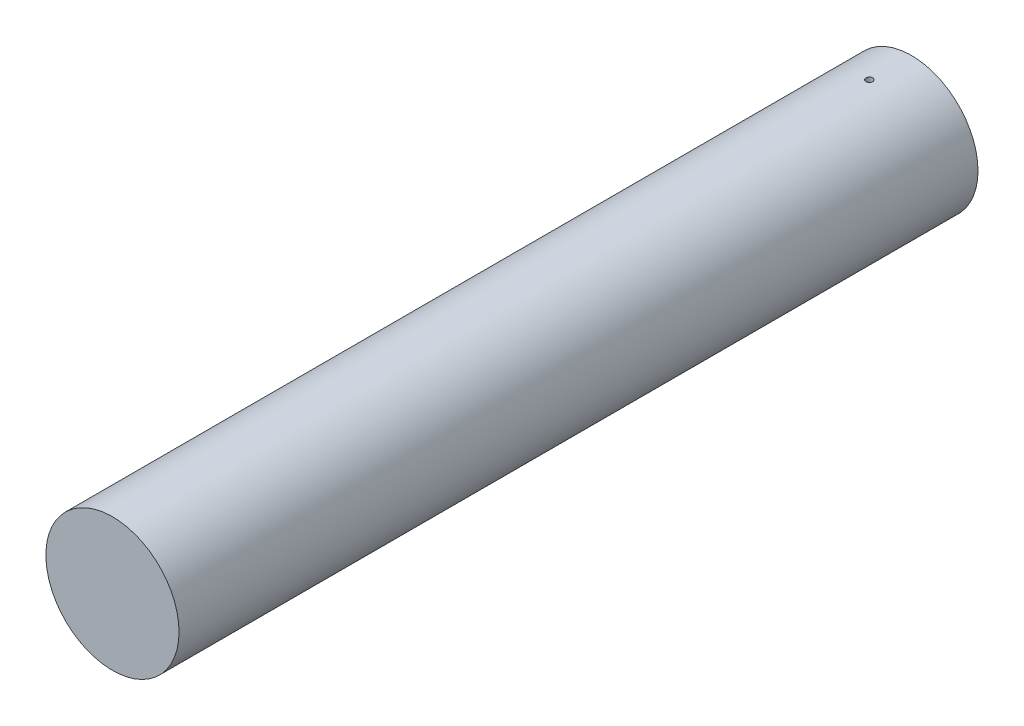
ISO-10303-21;
HEADER;
FILE_DESCRIPTION(('STEP AP214'),'2;1');
FILE_NAME('part.step','',(''),(''),'','','');
FILE_SCHEMA(('AUTOMOTIVE_DESIGN { 1 0 10303 214 1 1 1 1 }'));
ENDSEC;
DATA;
#1=APPLICATION_CONTEXT('core data for automotive mechanical design processes');
#2=APPLICATION_PROTOCOL_DEFINITION('international standard','automotive_design',2000,#1);
#3=PRODUCT_CONTEXT('',#1,'mechanical');
#4=PRODUCT('Part','Part','',(#3));
#5=PRODUCT_RELATED_PRODUCT_CATEGORY('part','',(#4));
#6=PRODUCT_DEFINITION_FORMATION('','',#4);
#7=PRODUCT_DEFINITION_CONTEXT('part definition',#1,'design');
#8=PRODUCT_DEFINITION('design','',#6,#7);
#9=PRODUCT_DEFINITION_SHAPE('','',#8);
#10=(LENGTH_UNIT() NAMED_UNIT(*) SI_UNIT(.MILLI.,.METRE.));
#11=(NAMED_UNIT(*) PLANE_ANGLE_UNIT() SI_UNIT($,.RADIAN.));
#12=(NAMED_UNIT(*) SI_UNIT($,.STERADIAN.) SOLID_ANGLE_UNIT());
#13=UNCERTAINTY_MEASURE_WITH_UNIT(LENGTH_MEASURE(1.E-05),#10,'distance_accuracy_value','');
#14=(GEOMETRIC_REPRESENTATION_CONTEXT(3) GLOBAL_UNCERTAINTY_ASSIGNED_CONTEXT((#13)) GLOBAL_UNIT_ASSIGNED_CONTEXT((#10,
#11,#12)) REPRESENTATION_CONTEXT('',''));
#15=CARTESIAN_POINT('',(0.,0.,0.));
#16=DIRECTION('',(0.,0.,1.));
#17=DIRECTION('',(1.,0.,0.));
#18=AXIS2_PLACEMENT_3D('',#15,#16,#17);
#19=CARTESIAN_POINT('',(0.,0.,1200.));
#20=DIRECTION('',(0.,0.,-1.));
#21=DIRECTION('',(-1.,0.,0.));
#22=AXIS2_PLACEMENT_3D('',#19,#20,#21);
#23=CYLINDRICAL_SURFACE('',#22,100.);
#24=CARTESIAN_POINT('',(0.,-100.,68.2187361680543));
#25=CARTESIAN_POINT('',(0.140382331642108,-100.000000151709,68.2187372645341));
#26=CARTESIAN_POINT('',(0.280747001896507,-99.9997037754659,68.2128216270186));
#27=CARTESIAN_POINT('',(0.560524196558807,-99.9985268736247,68.1892010135076));
#28=CARTESIAN_POINT('',(0.699936466667358,-99.9976461977334,68.1714930042812));
#29=CARTESIAN_POINT('',(0.976889775376588,-99.9953243132263,68.1243896383801));
#30=CARTESIAN_POINT('',(1.11442908371018,-99.9938826184667,68.0949841449047));
#31=CARTESIAN_POINT('',(1.38658724710948,-99.9904790634305,68.0246840844455));
#32=CARTESIAN_POINT('',(1.52120501520938,-99.9885170130257,67.9837853177065));
#33=CARTESIAN_POINT('',(1.78639315934099,-99.9841306024051,67.8908367115256));
#34=CARTESIAN_POINT('',(1.91696698591416,-99.981706649696,67.8387966963325));
#35=CARTESIAN_POINT('',(2.17331240026984,-99.9764630122289,67.7238942423942));
#36=CARTESIAN_POINT('',(2.29908219956735,-99.9736431818819,67.6610278201668));
#37=CARTESIAN_POINT('',(2.54480238231387,-99.9676901690869,67.5249748019133));
#38=CARTESIAN_POINT('',(2.66475624707842,-99.964557177618,67.451794484718));
#39=CARTESIAN_POINT('',(2.8981207370113,-99.9580638527808,67.2955755440559));
#40=CARTESIAN_POINT('',(3.01152892859555,-99.9547034358551,67.2125332887055));
#41=CARTESIAN_POINT('',(3.23100816315515,-99.9478496510534,67.0371558047236));
#42=CARTESIAN_POINT('',(3.3370753956072,-99.9443562155676,66.9448158099962));
#43=CARTESIAN_POINT('',(3.54109502521835,-99.9373357216052,66.7514974573342));
#44=CARTESIAN_POINT('',(3.63904441068014,-99.9338086511865,66.6505159214033));
#45=CARTESIAN_POINT('',(3.82605934353567,-99.9268233553023,66.4406941568297));
#46=CARTESIAN_POINT('',(3.91512779404841,-99.9233651076368,66.3318565164848));
#47=CARTESIAN_POINT('',(4.08381675400835,-99.9166130902244,66.1070228313191));
#48=CARTESIAN_POINT('',(4.16343376352364,-99.9133193816671,65.9910241587401));
#49=CARTESIAN_POINT('',(4.31262612511524,-99.9069909192761,65.7527094566765));
#50=CARTESIAN_POINT('',(4.38220006964921,-99.9039562017646,65.630392544942));
#51=CARTESIAN_POINT('',(4.51082108672322,-99.8982314106714,65.3802815927036));
#52=CARTESIAN_POINT('',(4.56986426013316,-99.8955414648486,65.252485545125));
#53=CARTESIAN_POINT('',(4.67695059650787,-99.8905852183931,64.992402583605));
#54=CARTESIAN_POINT('',(4.72499788182476,-99.8883187590543,64.8601173740756));
#55=CARTESIAN_POINT('',(4.80979140715572,-99.8842714358876,64.5919516581793));
#56=CARTESIAN_POINT('',(4.84653347264903,-99.8824907514625,64.4560698438101));
#57=CARTESIAN_POINT('',(4.93926590709582,-99.8779640739555,64.0448015426298));
#58=CARTESIAN_POINT('',(4.97797010270561,-99.8760235204944,63.7652866555873));
#59=CARTESIAN_POINT('',(5.00788534193595,-99.87452764563,63.2038726531668));
#60=CARTESIAN_POINT('',(4.99909676034997,-99.8749723054035,62.9219735566214));
#61=CARTESIAN_POINT('',(4.93436994296618,-99.8781909718618,62.3638740982336));
#62=CARTESIAN_POINT('',(4.87847401910178,-99.8809628881905,62.087668850165));
#63=CARTESIAN_POINT('',(4.7211683336521,-99.8885214351435,61.5485775580015));
#64=CARTESIAN_POINT('',(4.61975837974242,-99.8933080742813,61.2856915701939));
#65=CARTESIAN_POINT('',(4.3742593576816,-99.9043586910608,60.7805515394792));
#66=CARTESIAN_POINT('',(4.2301509943017,-99.9106233363459,60.5383068881649));
#67=CARTESIAN_POINT('',(3.90335874171009,-99.9239232752185,60.0814322661756));
#68=CARTESIAN_POINT('',(3.7206745802611,-99.9309585742444,59.8668024904015));
#69=CARTESIAN_POINT('',(3.32167794035939,-99.9450161471153,59.4710028769493));
#70=CARTESIAN_POINT('',(3.10532881072658,-99.9520383982217,59.2898699834637));
#71=CARTESIAN_POINT('',(2.64527231828994,-99.9652709741623,58.9664907744451));
#72=CARTESIAN_POINT('',(2.40156494875667,-99.9714812987967,58.8242444684771));
#73=CARTESIAN_POINT('',(1.89368834948846,-99.9823903793968,58.5826797611245));
#74=CARTESIAN_POINT('',(1.62951850556093,-99.9870890899686,58.4833626488728));
#75=CARTESIAN_POINT('',(1.08822535462864,-99.9944447283325,58.3304997455132));
#76=CARTESIAN_POINT('',(0.811102144612571,-99.9971016714097,58.2769536117516));
#77=CARTESIAN_POINT('',(0.252089503471185,-100.000072367754,58.2171981717969));
#78=CARTESIAN_POINT('',(-0.0297944524263533,-100.000388650516,58.2109377649211));
#79=CARTESIAN_POINT('',(-0.590608868682878,-99.9986490964682,58.2457981394827));
#80=CARTESIAN_POINT('',(-0.869539338806887,-99.9965932675041,58.2869187642163));
#81=CARTESIAN_POINT('',(-1.41638577654089,-99.9903426716758,58.415331623414));
#82=CARTESIAN_POINT('',(-1.68430723657538,-99.9861489857459,58.502600525411));
#83=CARTESIAN_POINT('',(-2.20169952573277,-99.9760948290851,58.7208091104926));
#84=CARTESIAN_POINT('',(-2.4511702486381,-99.9702343487596,58.8517490449595));
#85=CARTESIAN_POINT('',(-2.92481416604305,-99.9574995746791,59.1537133509289));
#86=CARTESIAN_POINT('',(-3.14896549854525,-99.9506244164372,59.3247719767536));
#87=CARTESIAN_POINT('',(-3.56538787634977,-99.9366374558743,59.7020688911855));
#88=CARTESIAN_POINT('',(-3.75765871710981,-99.9295256520354,59.9083074054863));
#89=CARTESIAN_POINT('',(-4.1050346820204,-99.9158597154952,60.3503258339873));
#90=CARTESIAN_POINT('',(-4.26010674378105,-99.9093060822093,60.5861317464616));
#91=CARTESIAN_POINT('',(-4.5284557546084,-99.8975035347386,61.0804738746706));
#92=CARTESIAN_POINT('',(-4.64173288557038,-99.8922546148757,61.3390099914753));
#93=CARTESIAN_POINT('',(-4.82322443895271,-99.8836563023528,61.8712990677888));
#94=CARTESIAN_POINT('',(-4.89145993688818,-99.8803060214012,62.1450448454146));
#95=CARTESIAN_POINT('',(-4.98097942137543,-99.8758827218868,62.7002776488897));
#96=CARTESIAN_POINT('',(-5.00226367448989,-99.8748096903952,62.9817646307795));
#97=CARTESIAN_POINT('',(-4.99857754835033,-99.8749923692367,63.4032456376788));
#98=CARTESIAN_POINT('',(-4.99141367944853,-99.8753519535838,63.5436129522638));
#99=CARTESIAN_POINT('',(-4.96530608065759,-99.8766536223232,63.8232310234253));
#100=CARTESIAN_POINT('',(-4.94636670495808,-99.8775954914052,63.962482173453));
#101=CARTESIAN_POINT('',(-4.89682917982177,-99.8800363900157,64.2389331278707));
#102=CARTESIAN_POINT('',(-4.8662267174971,-99.8815356256475,64.3761321538783));
#103=CARTESIAN_POINT('',(-4.79359839136104,-99.8850476130617,64.6474142089162));
#104=CARTESIAN_POINT('',(-4.75157673655706,-99.8870601756199,64.7814983663303));
#105=CARTESIAN_POINT('',(-4.6563864767371,-99.8915428532724,65.0456978790198));
#106=CARTESIAN_POINT('',(-4.60321370373139,-99.8940131394113,65.1758117294113));
#107=CARTESIAN_POINT('',(-4.48613154961846,-99.8993396100469,65.4310493950305));
#108=CARTESIAN_POINT('',(-4.42222612645512,-99.9021956522102,65.5561750288213));
#109=CARTESIAN_POINT('',(-4.28409600695338,-99.9082143744938,65.8006422750243));
#110=CARTESIAN_POINT('',(-4.20986784908656,-99.9113771573656,65.9199819290413));
#111=CARTESIAN_POINT('',(-4.05166478680281,-99.9179176882867,66.1519449954693));
#112=CARTESIAN_POINT('',(-3.96769347409327,-99.9212953569146,66.2645708598144));
#113=CARTESIAN_POINT('',(-3.79045674161889,-99.9281757588154,66.4825056846767));
#114=CARTESIAN_POINT('',(-3.69717888266711,-99.9316786553476,66.5878045241353));
#115=CARTESIAN_POINT('',(-3.50212194671802,-99.9387045122761,66.7901337596339));
#116=CARTESIAN_POINT('',(-3.40034601038945,-99.9422274648157,66.8871671838078));
#117=CARTESIAN_POINT('',(-3.1889189042621,-99.9491970333131,67.0723785294958));
#118=CARTESIAN_POINT('',(-3.07926292714261,-99.952643600965,67.1605509652265));
#119=CARTESIAN_POINT('',(-2.85295061471676,-99.9593591464897,67.3273153051178));
#120=CARTESIAN_POINT('',(-2.73629687589383,-99.9626281893849,67.4059107303663));
#121=CARTESIAN_POINT('',(-2.49661953469714,-99.9689015548178,67.5530981968624));
#122=CARTESIAN_POINT('',(-2.3735876749519,-99.9719055198649,67.6216768083982));
#123=CARTESIAN_POINT('',(-2.12221863794283,-99.9775574091476,67.7481930557582));
#124=CARTESIAN_POINT('',(-1.99388341895568,-99.9802054632949,67.8061345770903));
#125=CARTESIAN_POINT('',(-1.73288930064207,-99.9850694351866,67.9109479402222));
#126=CARTESIAN_POINT('',(-1.60023427857055,-99.9872857286261,67.9578294134481));
#127=CARTESIAN_POINT('',(-1.33148381690986,-99.9912256894904,68.0402406554004));
#128=CARTESIAN_POINT('',(-1.19538927648153,-99.9929494842439,68.0757733584718));
#129=CARTESIAN_POINT('',(-0.884387493405927,-99.9962397938324,68.1431047786217));
#130=CARTESIAN_POINT('',(-0.708718247555083,-99.9976446676185,68.1714417092026));
#131=CARTESIAN_POINT('',(-0.355356570711758,-99.9995246743061,68.2092567020352));
#132=CARTESIAN_POINT('',(-0.177664141445725,-99.999999808001,68.2187347803786));
#133=CARTESIAN_POINT('',(0.,-100.,68.2187361680543));
#134=B_SPLINE_CURVE_WITH_KNOTS('',3,(#24,#25,#26,#27,#28,#29,#30,#31,#32,#33,#34,#35,#36,#37,
#38,#39,#40,#41,#42,#43,#44,#45,#46,#47,#48,#49,#50,#51,#52,#53,#54,#55,#56,#57,#58,#59,#60,#61,
#62,#63,#64,#65,#66,#67,#68,#69,#70,#71,#72,#73,#74,#75,#76,#77,#78,#79,#80,#81,#82,#83,#84,#85,
#86,#87,#88,#89,#90,#91,#92,#93,#94,#95,#96,#97,#98,#99,#100,#101,#102,#103,#104,#105,#106,#107,
#108,#109,#110,#111,#112,#113,#114,#115,#116,#117,#118,#119,#120,#121,#122,#123,#124,#125,#126,
#127,#128,#129,#130,#131,#132,#133),.UNSPECIFIED.,.T.,.F.,(4,2,2,2,2,2,2,2,2,2,2,2,2,2,2,2,2,2,
2,2,2,2,2,2,2,2,2,2,2,2,2,2,2,2,2,2,2,2,2,2,2,2,2,2,2,2,2,2,2,2,2,2,2,2,4),(0.,
0.420991766300549,0.842091861845549,1.2635576718506,1.68517769031119,2.10642744830025,
2.52783253392271,2.94898217840585,3.37028740464198,3.79180970554695,4.21348769639668,
4.6350273884405,5.05672269571444,5.47847704660818,5.90038723381811,6.3221389870788,
6.74404628834471,7.58624182332896,8.42843071206195,9.26986394983489,10.1113007432074,
10.9531183597123,11.7949419172948,12.6376884678758,13.4804352257519,14.3232072889514,
15.1659730428822,16.0078279072425,16.8496799873329,17.6911068352556,18.5325385267443,
19.3746912856819,20.2168494475845,21.0597533716675,21.9026536273136,22.7451591998129,
23.5876599890285,24.0089016973097,24.4299877370165,24.8512296412756,25.2723164898215,
25.6935610107844,26.1146505266156,26.5358815886492,26.9569578588808,27.3786046802741,
27.8000963558864,28.2218473873641,28.6434428867912,29.0655985378535,29.4875996760662,
29.909231955023,30.3307551280559,30.8635515537955,31.3963475249166),.UNSPECIFIED.);
#135=CARTESIAN_POINT('',(0.,-100.,68.2187361680543));
#136=VERTEX_POINT('',#135);
#137=EDGE_CURVE('E10',#136,#136,#134,.T.);
#138=ORIENTED_EDGE('',*,*,#137,.T.);
#139=EDGE_LOOP('',(#138));
#140=FACE_BOUND('',#139,.T.);
#141=CARTESIAN_POINT('',(0.,100.,68.2187361680543));
#142=CARTESIAN_POINT('',(-0.140382331642108,100.000000151709,68.2187372645341));
#143=CARTESIAN_POINT('',(-0.280747001896507,99.9997037754659,68.2128216270186));
#144=CARTESIAN_POINT('',(-0.560524196558807,99.9985268736247,68.1892010135076));
#145=CARTESIAN_POINT('',(-0.699936466667358,99.9976461977334,68.1714930042812));
#146=CARTESIAN_POINT('',(-0.976889775376588,99.9953243132263,68.1243896383801));
#147=CARTESIAN_POINT('',(-1.11442908371018,99.9938826184667,68.0949841449047));
#148=CARTESIAN_POINT('',(-1.38658724710948,99.9904790634305,68.0246840844455));
#149=CARTESIAN_POINT('',(-1.52120501520938,99.9885170130257,67.9837853177065));
#150=CARTESIAN_POINT('',(-1.78639315934099,99.9841306024051,67.8908367115256));
#151=CARTESIAN_POINT('',(-1.91696698591416,99.981706649696,67.8387966963325));
#152=CARTESIAN_POINT('',(-2.17331240026984,99.9764630122289,67.7238942423942));
#153=CARTESIAN_POINT('',(-2.29908219956735,99.9736431818819,67.6610278201668));
#154=CARTESIAN_POINT('',(-2.54480238231387,99.9676901690869,67.5249748019133));
#155=CARTESIAN_POINT('',(-2.66475624707842,99.964557177618,67.451794484718));
#156=CARTESIAN_POINT('',(-2.8981207370113,99.9580638527808,67.2955755440559));
#157=CARTESIAN_POINT('',(-3.01152892859555,99.9547034358551,67.2125332887055));
#158=CARTESIAN_POINT('',(-3.23100816315515,99.9478496510534,67.0371558047236));
#159=CARTESIAN_POINT('',(-3.3370753956072,99.9443562155676,66.9448158099962));
#160=CARTESIAN_POINT('',(-3.54109502521835,99.9373357216052,66.7514974573342));
#161=CARTESIAN_POINT('',(-3.63904441068014,99.9338086511865,66.6505159214033));
#162=CARTESIAN_POINT('',(-3.82605934353567,99.9268233553023,66.4406941568297));
#163=CARTESIAN_POINT('',(-3.91512779404841,99.9233651076368,66.3318565164848));
#164=CARTESIAN_POINT('',(-4.08381675400835,99.9166130902244,66.1070228313191));
#165=CARTESIAN_POINT('',(-4.16343376352364,99.9133193816671,65.9910241587401));
#166=CARTESIAN_POINT('',(-4.31262612511524,99.9069909192761,65.7527094566765));
#167=CARTESIAN_POINT('',(-4.38220006964921,99.9039562017646,65.630392544942));
#168=CARTESIAN_POINT('',(-4.51082108672322,99.8982314106714,65.3802815927036));
#169=CARTESIAN_POINT('',(-4.56986426013316,99.8955414648486,65.252485545125));
#170=CARTESIAN_POINT('',(-4.67695059650787,99.8905852183931,64.992402583605));
#171=CARTESIAN_POINT('',(-4.72499788182476,99.8883187590543,64.8601173740756));
#172=CARTESIAN_POINT('',(-4.80979140715572,99.8842714358876,64.5919516581793));
#173=CARTESIAN_POINT('',(-4.84653347264903,99.8824907514625,64.4560698438101));
#174=CARTESIAN_POINT('',(-4.93926590709582,99.8779640739555,64.0448015426298));
#175=CARTESIAN_POINT('',(-4.97797010270561,99.8760235204944,63.7652866555873));
#176=CARTESIAN_POINT('',(-5.00788534193595,99.87452764563,63.2038726531668));
#177=CARTESIAN_POINT('',(-4.99909676034997,99.8749723054035,62.9219735566214));
#178=CARTESIAN_POINT('',(-4.93436994296618,99.8781909718618,62.3638740982336));
#179=CARTESIAN_POINT('',(-4.87847401910178,99.8809628881905,62.087668850165));
#180=CARTESIAN_POINT('',(-4.7211683336521,99.8885214351435,61.5485775580015));
#181=CARTESIAN_POINT('',(-4.61975837974242,99.8933080742813,61.2856915701939));
#182=CARTESIAN_POINT('',(-4.3742593576816,99.9043586910608,60.7805515394792));
#183=CARTESIAN_POINT('',(-4.2301509943017,99.9106233363459,60.5383068881649));
#184=CARTESIAN_POINT('',(-3.90335874171009,99.9239232752185,60.0814322661756));
#185=CARTESIAN_POINT('',(-3.7206745802611,99.9309585742444,59.8668024904015));
#186=CARTESIAN_POINT('',(-3.32167794035939,99.9450161471153,59.4710028769493));
#187=CARTESIAN_POINT('',(-3.10532881072658,99.9520383982217,59.2898699834637));
#188=CARTESIAN_POINT('',(-2.64527231828994,99.9652709741623,58.9664907744451));
#189=CARTESIAN_POINT('',(-2.40156494875667,99.9714812987967,58.8242444684771));
#190=CARTESIAN_POINT('',(-1.89368834948846,99.9823903793968,58.5826797611245));
#191=CARTESIAN_POINT('',(-1.62951850556093,99.9870890899686,58.4833626488728));
#192=CARTESIAN_POINT('',(-1.08822535462864,99.9944447283325,58.3304997455132));
#193=CARTESIAN_POINT('',(-0.811102144612571,99.9971016714097,58.2769536117516));
#194=CARTESIAN_POINT('',(-0.252089503471185,100.000072367754,58.2171981717969));
#195=CARTESIAN_POINT('',(0.0297944524263533,100.000388650516,58.2109377649211));
#196=CARTESIAN_POINT('',(0.590608868682878,99.9986490964682,58.2457981394827));
#197=CARTESIAN_POINT('',(0.869539338806887,99.9965932675041,58.2869187642163));
#198=CARTESIAN_POINT('',(1.41638577654089,99.9903426716758,58.415331623414));
#199=CARTESIAN_POINT('',(1.68430723657538,99.9861489857459,58.502600525411));
#200=CARTESIAN_POINT('',(2.20169952573277,99.9760948290851,58.7208091104926));
#201=CARTESIAN_POINT('',(2.4511702486381,99.9702343487596,58.8517490449595));
#202=CARTESIAN_POINT('',(2.92481416604305,99.9574995746791,59.1537133509289));
#203=CARTESIAN_POINT('',(3.14896549854525,99.9506244164372,59.3247719767536));
#204=CARTESIAN_POINT('',(3.56538787634977,99.9366374558743,59.7020688911855));
#205=CARTESIAN_POINT('',(3.75765871710981,99.9295256520354,59.9083074054863));
#206=CARTESIAN_POINT('',(4.1050346820204,99.9158597154952,60.3503258339873));
#207=CARTESIAN_POINT('',(4.26010674378105,99.9093060822093,60.5861317464616));
#208=CARTESIAN_POINT('',(4.5284557546084,99.8975035347386,61.0804738746706));
#209=CARTESIAN_POINT('',(4.64173288557038,99.8922546148757,61.3390099914753));
#210=CARTESIAN_POINT('',(4.82322443895271,99.8836563023528,61.8712990677888));
#211=CARTESIAN_POINT('',(4.89145993688818,99.8803060214012,62.1450448454146));
#212=CARTESIAN_POINT('',(4.98097942137543,99.8758827218868,62.7002776488897));
#213=CARTESIAN_POINT('',(5.00226367448989,99.8748096903952,62.9817646307795));
#214=CARTESIAN_POINT('',(4.99857754835033,99.8749923692367,63.4032456376788));
#215=CARTESIAN_POINT('',(4.99141367944853,99.8753519535838,63.5436129522638));
#216=CARTESIAN_POINT('',(4.96530608065759,99.8766536223232,63.8232310234253));
#217=CARTESIAN_POINT('',(4.94636670495808,99.8775954914052,63.962482173453));
#218=CARTESIAN_POINT('',(4.89682917982177,99.8800363900157,64.2389331278707));
#219=CARTESIAN_POINT('',(4.8662267174971,99.8815356256475,64.3761321538783));
#220=CARTESIAN_POINT('',(4.79359839136104,99.8850476130617,64.6474142089162));
#221=CARTESIAN_POINT('',(4.75157673655706,99.8870601756199,64.7814983663303));
#222=CARTESIAN_POINT('',(4.6563864767371,99.8915428532724,65.0456978790198));
#223=CARTESIAN_POINT('',(4.60321370373139,99.8940131394113,65.1758117294113));
#224=CARTESIAN_POINT('',(4.48613154961846,99.8993396100469,65.4310493950305));
#225=CARTESIAN_POINT('',(4.42222612645512,99.9021956522102,65.5561750288213));
#226=CARTESIAN_POINT('',(4.28409600695338,99.9082143744938,65.8006422750243));
#227=CARTESIAN_POINT('',(4.20986784908656,99.9113771573656,65.9199819290413));
#228=CARTESIAN_POINT('',(4.05166478680281,99.9179176882867,66.1519449954693));
#229=CARTESIAN_POINT('',(3.96769347409327,99.9212953569146,66.2645708598144));
#230=CARTESIAN_POINT('',(3.79045674161889,99.9281757588154,66.4825056846767));
#231=CARTESIAN_POINT('',(3.69717888266711,99.9316786553476,66.5878045241353));
#232=CARTESIAN_POINT('',(3.50212194671802,99.9387045122761,66.7901337596339));
#233=CARTESIAN_POINT('',(3.40034601038945,99.9422274648157,66.8871671838078));
#234=CARTESIAN_POINT('',(3.1889189042621,99.9491970333131,67.0723785294958));
#235=CARTESIAN_POINT('',(3.07926292714261,99.952643600965,67.1605509652265));
#236=CARTESIAN_POINT('',(2.85295061471676,99.9593591464897,67.3273153051178));
#237=CARTESIAN_POINT('',(2.73629687589383,99.9626281893849,67.4059107303663));
#238=CARTESIAN_POINT('',(2.49661953469714,99.9689015548178,67.5530981968624));
#239=CARTESIAN_POINT('',(2.3735876749519,99.9719055198649,67.6216768083982));
#240=CARTESIAN_POINT('',(2.12221863794283,99.9775574091476,67.7481930557582));
#241=CARTESIAN_POINT('',(1.99388341895568,99.9802054632949,67.8061345770903));
#242=CARTESIAN_POINT('',(1.73288930064207,99.9850694351866,67.9109479402222));
#243=CARTESIAN_POINT('',(1.60023427857055,99.9872857286261,67.9578294134481));
#244=CARTESIAN_POINT('',(1.33148381690986,99.9912256894904,68.0402406554004));
#245=CARTESIAN_POINT('',(1.19538927648153,99.9929494842439,68.0757733584718));
#246=CARTESIAN_POINT('',(0.884387493405927,99.9962397938324,68.1431047786217));
#247=CARTESIAN_POINT('',(0.708718247555083,99.9976446676185,68.1714417092026));
#248=CARTESIAN_POINT('',(0.355356570711758,99.9995246743061,68.2092567020352));
#249=CARTESIAN_POINT('',(0.177664141445725,99.999999808001,68.2187347803786));
#250=CARTESIAN_POINT('',(0.,100.,68.2187361680543));
#251=B_SPLINE_CURVE_WITH_KNOTS('',3,(#141,#142,#143,#144,#145,#146,#147,#148,#149,#150,#151,
#152,#153,#154,#155,#156,#157,#158,#159,#160,#161,#162,#163,#164,#165,#166,#167,#168,#169,#170,
#171,#172,#173,#174,#175,#176,#177,#178,#179,#180,#181,#182,#183,#184,#185,#186,#187,#188,#189,
#190,#191,#192,#193,#194,#195,#196,#197,#198,#199,#200,#201,#202,#203,#204,#205,#206,#207,#208,
#209,#210,#211,#212,#213,#214,#215,#216,#217,#218,#219,#220,#221,#222,#223,#224,#225,#226,#227,
#228,#229,#230,#231,#232,#233,#234,#235,#236,#237,#238,#239,#240,#241,#242,#243,#244,#245,#246,
#247,#248,#249,#250),.UNSPECIFIED.,.T.,.F.,(4,2,2,2,2,2,2,2,2,2,2,2,2,2,2,2,2,2,2,2,2,2,2,2,2,2,
2,2,2,2,2,2,2,2,2,2,2,2,2,2,2,2,2,2,2,2,2,2,2,2,2,2,2,2,4),(0.,0.420991766300549,
0.842091861845549,1.2635576718506,1.68517769031119,2.10642744830025,2.52783253392271,
2.94898217840585,3.37028740464198,3.79180970554695,4.21348769639668,4.6350273884405,
5.05672269571444,5.47847704660818,5.90038723381811,6.3221389870788,6.74404628834471,
7.58624182332896,8.42843071206195,9.26986394983489,10.1113007432074,10.9531183597123,
11.7949419172948,12.6376884678758,13.4804352257519,14.3232072889514,15.1659730428822,
16.0078279072425,16.8496799873329,17.6911068352556,18.5325385267443,19.3746912856819,
20.2168494475845,21.0597533716675,21.9026536273136,22.7451591998129,23.5876599890285,
24.0089016973097,24.4299877370165,24.8512296412756,25.2723164898215,25.6935610107844,
26.1146505266156,26.5358815886492,26.9569578588808,27.3786046802741,27.8000963558864,
28.2218473873641,28.6434428867912,29.0655985378535,29.4875996760662,29.909231955023,
30.3307551280559,30.8635515537955,31.3963475249166),.UNSPECIFIED.);
#252=CARTESIAN_POINT('',(0.,100.,68.2187361680543));
#253=VERTEX_POINT('',#252);
#254=EDGE_CURVE('E48',#253,#253,#251,.T.);
#255=ORIENTED_EDGE('',*,*,#254,.T.);
#256=EDGE_LOOP('',(#255));
#257=FACE_BOUND('',#256,.T.);
#258=CARTESIAN_POINT('',(0.,0.,1200.));
#259=DIRECTION('',(0.,0.,1.));
#260=DIRECTION('',(1.,0.,0.));
#261=AXIS2_PLACEMENT_3D('',#258,#259,#260);
#262=CIRCLE('',#261,100.);
#263=CARTESIAN_POINT('',(100.,0.,1200.));
#264=VERTEX_POINT('',#263);
#265=EDGE_CURVE('E52',#264,#264,#262,.T.);
#266=ORIENTED_EDGE('',*,*,#265,.F.);
#267=EDGE_LOOP('',(#266));
#268=FACE_BOUND('',#267,.T.);
#269=CARTESIAN_POINT('',(0.,0.,0.));
#270=DIRECTION('',(0.,0.,1.));
#271=DIRECTION('',(1.,0.,0.));
#272=AXIS2_PLACEMENT_3D('',#269,#270,#271);
#273=CIRCLE('',#272,100.);
#274=CARTESIAN_POINT('',(100.,0.,0.));
#275=VERTEX_POINT('',#274);
#276=EDGE_CURVE('E56',#275,#275,#273,.T.);
#277=ORIENTED_EDGE('',*,*,#276,.T.);
#278=EDGE_LOOP('',(#277));
#279=FACE_BOUND('',#278,.T.);
#280=ADVANCED_FACE('F37',(#140,#257,#268,#279),#23,.T.);
#281=CARTESIAN_POINT('',(0.,0.,1200.));
#282=DIRECTION('',(0.,0.,1.));
#283=DIRECTION('',(1.,0.,0.));
#284=AXIS2_PLACEMENT_3D('',#281,#282,#283);
#285=PLANE('',#284);
#286=ORIENTED_EDGE('',*,*,#265,.T.);
#287=EDGE_LOOP('',(#286));
#288=FACE_BOUND('',#287,.T.);
#289=ADVANCED_FACE('F68',(#288),#285,.T.);
#290=CARTESIAN_POINT('',(0.,0.,0.));
#291=DIRECTION('',(0.,0.,1.));
#292=DIRECTION('',(1.,0.,0.));
#293=AXIS2_PLACEMENT_3D('',#290,#291,#292);
#294=PLANE('',#293);
#295=ORIENTED_EDGE('',*,*,#276,.F.);
#296=EDGE_LOOP('',(#295));
#297=FACE_BOUND('',#296,.T.);
#298=ADVANCED_FACE('F66',(#297),#294,.F.);
#299=CARTESIAN_POINT('',(0.,-100.,63.2187361680543));
#300=DIRECTION('',(0.,1.,0.));
#301=DIRECTION('',(0.,0.,1.));
#302=AXIS2_PLACEMENT_3D('',#299,#300,#301);
#303=CYLINDRICAL_SURFACE('',#302,5.);
#304=ORIENTED_EDGE('',*,*,#254,.F.);
#305=EDGE_LOOP('',(#304));
#306=FACE_BOUND('',#305,.T.);
#307=ORIENTED_EDGE('',*,*,#137,.F.);
#308=EDGE_LOOP('',(#307));
#309=FACE_BOUND('',#308,.T.);
#310=ADVANCED_FACE('F62',(#306,#309),#303,.F.);
#311=CLOSED_SHELL('',(#280,#289,#298,#310));
#312=MANIFOLD_SOLID_BREP('B2',#311);
#313=ADVANCED_BREP_SHAPE_REPRESENTATION('',(#18,#312),#14);
#314=SHAPE_DEFINITION_REPRESENTATION(#9,#313);
ENDSEC;
END-ISO-10303-21;
